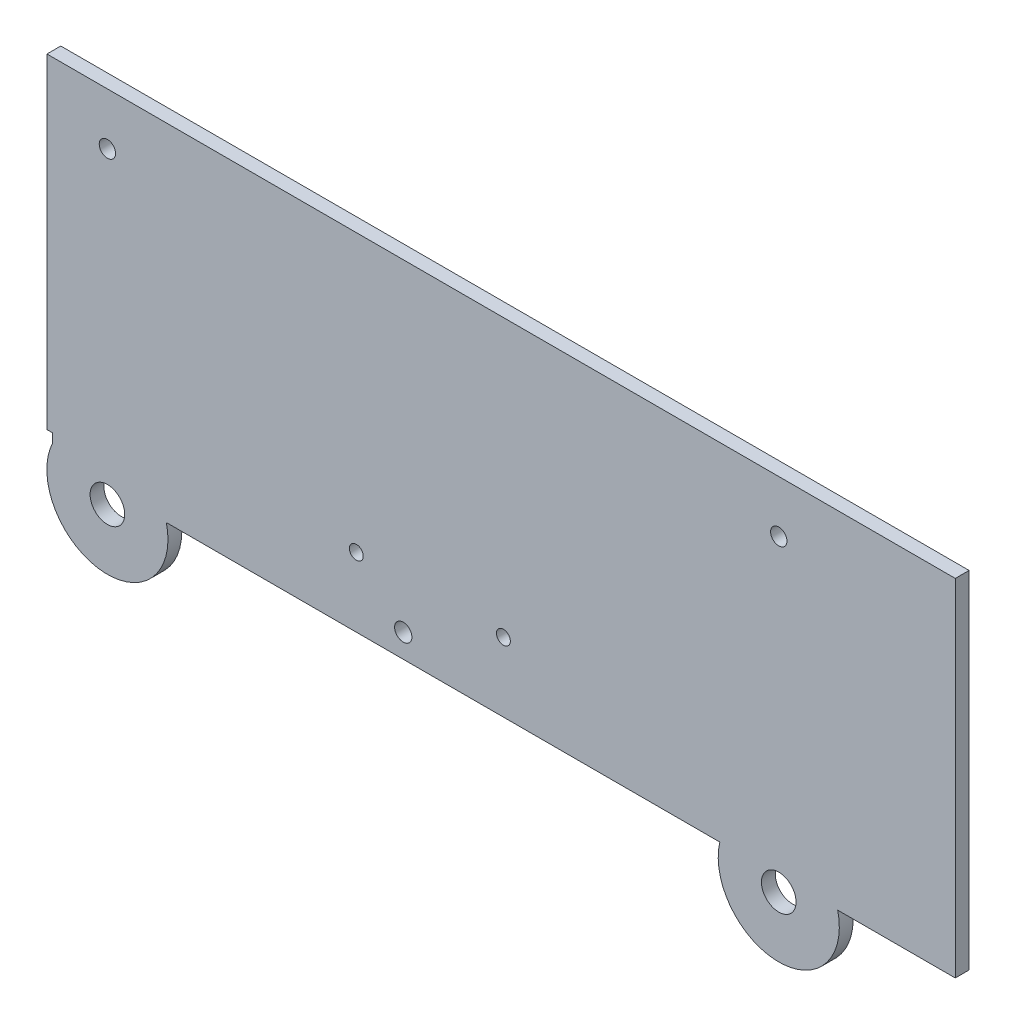
ISO-10303-21;
HEADER;
FILE_DESCRIPTION(('STEP AP214'),'2;1');
FILE_NAME('part.step','',(''),(''),'','','');
FILE_SCHEMA(('AUTOMOTIVE_DESIGN { 1 0 10303 214 1 1 1 1 }'));
ENDSEC;
DATA;
#1=APPLICATION_CONTEXT('core data for automotive mechanical design processes');
#2=APPLICATION_PROTOCOL_DEFINITION('international standard','automotive_design',2000,#1);
#3=PRODUCT_CONTEXT('',#1,'mechanical');
#4=PRODUCT('Part','Part','',(#3));
#5=PRODUCT_RELATED_PRODUCT_CATEGORY('part','',(#4));
#6=PRODUCT_DEFINITION_FORMATION('','',#4);
#7=PRODUCT_DEFINITION_CONTEXT('part definition',#1,'design');
#8=PRODUCT_DEFINITION('design','',#6,#7);
#9=PRODUCT_DEFINITION_SHAPE('','',#8);
#10=(LENGTH_UNIT() NAMED_UNIT(*) SI_UNIT(.MILLI.,.METRE.));
#11=(NAMED_UNIT(*) PLANE_ANGLE_UNIT() SI_UNIT($,.RADIAN.));
#12=(NAMED_UNIT(*) SI_UNIT($,.STERADIAN.) SOLID_ANGLE_UNIT());
#13=UNCERTAINTY_MEASURE_WITH_UNIT(LENGTH_MEASURE(1.E-05),#10,'distance_accuracy_value','');
#14=(GEOMETRIC_REPRESENTATION_CONTEXT(3) GLOBAL_UNCERTAINTY_ASSIGNED_CONTEXT((#13)) GLOBAL_UNIT_ASSIGNED_CONTEXT((#10,
#11,#12)) REPRESENTATION_CONTEXT('',''));
#15=CARTESIAN_POINT('',(0.,0.,0.));
#16=DIRECTION('',(0.,0.,1.));
#17=DIRECTION('',(1.,0.,0.));
#18=AXIS2_PLACEMENT_3D('',#15,#16,#17);
#19=CARTESIAN_POINT('',(0.,-31.75,-5.07492));
#20=DIRECTION('',(0.,-1.,0.));
#21=DIRECTION('',(0.,0.,-1.));
#22=AXIS2_PLACEMENT_3D('',#19,#20,#21);
#23=PLANE('',#22);
#24=DIRECTION('',(0.,0.,-1.));
#25=VECTOR('',#24,1.);
#26=CARTESIAN_POINT('',(101.426359202501,-31.75,0.));
#27=LINE('',#26,#25);
#28=CARTESIAN_POINT('',(101.426359202501,-31.75,0.));
#29=VERTEX_POINT('',#28);
#30=CARTESIAN_POINT('',(101.426359202501,-31.75,-5.07492));
#31=VERTEX_POINT('',#30);
#32=EDGE_CURVE('E209',#29,#31,#27,.T.);
#33=ORIENTED_EDGE('',*,*,#32,.F.);
#34=DIRECTION('',(1.,0.,0.));
#35=VECTOR('',#34,1.);
#36=CARTESIAN_POINT('',(0.,-31.75,0.));
#37=LINE('',#36,#35);
#38=CARTESIAN_POINT('',(-101.680359202501,-31.75,0.));
#39=VERTEX_POINT('',#38);
#40=EDGE_CURVE('E231',#39,#29,#37,.T.);
#41=ORIENTED_EDGE('',*,*,#40,.F.);
#42=DIRECTION('',(0.,0.,-1.));
#43=VECTOR('',#42,1.);
#44=CARTESIAN_POINT('',(-101.680359202501,-31.75,0.));
#45=LINE('',#44,#43);
#46=CARTESIAN_POINT('',(-101.680359202501,-31.75,-5.07492));
#47=VERTEX_POINT('',#46);
#48=EDGE_CURVE('E202',#47,#39,#45,.F.);
#49=ORIENTED_EDGE('',*,*,#48,.F.);
#50=DIRECTION('',(1.,0.,0.));
#51=VECTOR('',#50,1.);
#52=CARTESIAN_POINT('',(0.,-31.75,-5.07492));
#53=LINE('',#52,#51);
#54=EDGE_CURVE('E11',#47,#31,#53,.T.);
#55=ORIENTED_EDGE('',*,*,#54,.T.);
#56=EDGE_LOOP('',(#33,#41,#49,#55));
#57=FACE_BOUND('',#56,.T.);
#58=ADVANCED_FACE('F53',(#57),#23,.T.);
#59=CARTESIAN_POINT('',(-143.383,0.,-5.07492));
#60=DIRECTION('',(1.,0.,0.));
#61=DIRECTION('',(0.,0.,-1.));
#62=AXIS2_PLACEMENT_3D('',#59,#60,#61);
#63=PLANE('',#62);
#64=DIRECTION('',(0.,1.,0.));
#65=VECTOR('',#64,1.);
#66=CARTESIAN_POINT('',(-143.383,0.,0.));
#67=LINE('',#66,#65);
#68=CARTESIAN_POINT('',(-143.383,-27.2745686125639,0.));
#69=VERTEX_POINT('',#68);
#70=CARTESIAN_POINT('',(-143.383,-24.13,0.));
#71=VERTEX_POINT('',#70);
#72=EDGE_CURVE('E239',#69,#71,#67,.T.);
#73=ORIENTED_EDGE('',*,*,#72,.T.);
#74=DIRECTION('',(0.,0.,-1.));
#75=VECTOR('',#74,1.);
#76=CARTESIAN_POINT('',(-143.383,-24.13,-5.07492));
#77=LINE('',#76,#75);
#78=CARTESIAN_POINT('',(-143.383,-24.13,-5.07492));
#79=VERTEX_POINT('',#78);
#80=EDGE_CURVE('E133',#71,#79,#77,.T.);
#81=ORIENTED_EDGE('',*,*,#80,.T.);
#82=DIRECTION('',(0.,1.,0.));
#83=VECTOR('',#82,1.);
#84=CARTESIAN_POINT('',(-143.383,0.,-5.07492));
#85=LINE('',#84,#83);
#86=CARTESIAN_POINT('',(-143.383,-27.2745686125639,-5.07492));
#87=VERTEX_POINT('',#86);
#88=EDGE_CURVE('E63',#87,#79,#85,.T.);
#89=ORIENTED_EDGE('',*,*,#88,.F.);
#90=DIRECTION('',(0.,0.,-1.));
#91=VECTOR('',#90,1.);
#92=CARTESIAN_POINT('',(-143.383,-27.2745686125639,0.));
#93=LINE('',#92,#91);
#94=EDGE_CURVE('E190',#87,#69,#93,.F.);
#95=ORIENTED_EDGE('',*,*,#94,.T.);
#96=EDGE_LOOP('',(#73,#81,#89,#95));
#97=FACE_BOUND('',#96,.T.);
#98=ADVANCED_FACE('F305',(#97),#63,.F.);
#99=CARTESIAN_POINT('',(0.,95.25,-5.07492));
#100=DIRECTION('',(0.,-1.,0.));
#101=DIRECTION('',(0.,0.,-1.));
#102=AXIS2_PLACEMENT_3D('',#99,#100,#101);
#103=PLANE('',#102);
#104=DIRECTION('',(0.,0.,-1.));
#105=VECTOR('',#104,1.);
#106=CARTESIAN_POINT('',(187.833,95.25,0.));
#107=LINE('',#106,#105);
#108=CARTESIAN_POINT('',(187.833,95.25,0.));
#109=VERTEX_POINT('',#108);
#110=CARTESIAN_POINT('',(187.833,95.25,-5.07492));
#111=VERTEX_POINT('',#110);
#112=EDGE_CURVE('E217',#109,#111,#107,.T.);
#113=ORIENTED_EDGE('',*,*,#112,.T.);
#114=DIRECTION('',(1.,0.,0.));
#115=VECTOR('',#114,1.);
#116=CARTESIAN_POINT('',(0.,95.25,-5.07492));
#117=LINE('',#116,#115);
#118=CARTESIAN_POINT('',(-145.5039,95.25,-5.07492));
#119=VERTEX_POINT('',#118);
#120=EDGE_CURVE('E230',#119,#111,#117,.T.);
#121=ORIENTED_EDGE('',*,*,#120,.F.);
#122=DIRECTION('',(0.,0.,-1.));
#123=VECTOR('',#122,1.);
#124=CARTESIAN_POINT('',(-145.5039,95.25,0.));
#125=LINE('',#124,#123);
#126=CARTESIAN_POINT('',(-145.5039,95.25,0.));
#127=VERTEX_POINT('',#126);
#128=EDGE_CURVE('E148',#127,#119,#125,.T.);
#129=ORIENTED_EDGE('',*,*,#128,.F.);
#130=DIRECTION('',(1.,0.,0.));
#131=VECTOR('',#130,1.);
#132=CARTESIAN_POINT('',(0.,95.25,0.));
#133=LINE('',#132,#131);
#134=EDGE_CURVE('E153',#127,#109,#133,.T.);
#135=ORIENTED_EDGE('',*,*,#134,.T.);
#136=EDGE_LOOP('',(#113,#121,#129,#135));
#137=FACE_BOUND('',#136,.T.);
#138=ADVANCED_FACE('F55',(#137),#103,.F.);
#139=DIRECTION('',(0.,0.,-1.));
#140=VECTOR('',#139,1.);
#141=CARTESIAN_POINT('',(144.699640797499,-31.75,0.));
#142=LINE('',#141,#140);
#143=CARTESIAN_POINT('',(144.699640797499,-31.75,-5.07492));
#144=VERTEX_POINT('',#143);
#145=CARTESIAN_POINT('',(144.699640797499,-31.75,0.));
#146=VERTEX_POINT('',#145);
#147=EDGE_CURVE('E205',#144,#146,#142,.F.);
#148=ORIENTED_EDGE('',*,*,#147,.F.);
#149=CARTESIAN_POINT('',(187.833,-31.75,-5.07492));
#150=VERTEX_POINT('',#149);
#151=EDGE_CURVE('E65',#144,#150,#53,.T.);
#152=ORIENTED_EDGE('',*,*,#151,.T.);
#153=DIRECTION('',(0.,0.,-1.));
#154=VECTOR('',#153,1.);
#155=CARTESIAN_POINT('',(187.833,-31.75,0.));
#156=LINE('',#155,#154);
#157=CARTESIAN_POINT('',(187.833,-31.75,0.));
#158=VERTEX_POINT('',#157);
#159=EDGE_CURVE('E221',#158,#150,#156,.T.);
#160=ORIENTED_EDGE('',*,*,#159,.F.);
#161=EDGE_CURVE('E225',#146,#158,#37,.T.);
#162=ORIENTED_EDGE('',*,*,#161,.F.);
#163=EDGE_LOOP('',(#148,#152,#160,#162));
#164=FACE_BOUND('',#163,.T.);
#165=ADVANCED_FACE('F291',(#164),#23,.T.);
#166=CARTESIAN_POINT('',(0.,0.,-5.07492));
#167=DIRECTION('',(0.,0.,1.));
#168=DIRECTION('',(1.,0.,0.));
#169=AXIS2_PLACEMENT_3D('',#166,#167,#168);
#170=PLANE('',#169);
#171=CARTESIAN_POINT('',(22.0090999999999,-6.35,-5.07492));
#172=DIRECTION('',(0.,0.,-1.));
#173=DIRECTION('',(-1.,0.,0.));
#174=AXIS2_PLACEMENT_3D('',#171,#172,#173);
#175=CIRCLE('',#174,2.54);
#176=CARTESIAN_POINT('',(19.4690999999999,-6.35,-5.07492));
#177=VERTEX_POINT('',#176);
#178=EDGE_CURVE('E256',#177,#177,#175,.T.);
#179=ORIENTED_EDGE('',*,*,#178,.F.);
#180=EDGE_LOOP('',(#179));
#181=FACE_BOUND('',#180,.T.);
#182=CARTESIAN_POINT('',(-31.9659000000001,-6.35,-5.07492));
#183=DIRECTION('',(0.,0.,-1.));
#184=DIRECTION('',(-1.,0.,0.));
#185=AXIS2_PLACEMENT_3D('',#182,#183,#184);
#186=CIRCLE('',#185,2.54);
#187=CARTESIAN_POINT('',(-34.5059000000001,-6.35,-5.07492));
#188=VERTEX_POINT('',#187);
#189=EDGE_CURVE('E278',#188,#188,#186,.T.);
#190=ORIENTED_EDGE('',*,*,#189,.F.);
#191=EDGE_LOOP('',(#190));
#192=FACE_BOUND('',#191,.T.);
#193=CARTESIAN_POINT('',(-14.7458297790493,-23.114,-5.07492));
#194=DIRECTION('',(0.,0.,-1.));
#195=DIRECTION('',(-1.,0.,0.));
#196=AXIS2_PLACEMENT_3D('',#193,#194,#195);
#197=CIRCLE('',#196,3.175);
#198=CARTESIAN_POINT('',(-17.9208297790493,-23.114,-5.07492));
#199=VERTEX_POINT('',#198);
#200=EDGE_CURVE('E274',#199,#199,#197,.T.);
#201=ORIENTED_EDGE('',*,*,#200,.F.);
#202=EDGE_LOOP('',(#201));
#203=FACE_BOUND('',#202,.T.);
#204=CARTESIAN_POINT('',(123.063,76.2,-5.07492));
#205=DIRECTION('',(0.,0.,-1.));
#206=DIRECTION('',(-1.,0.,0.));
#207=AXIS2_PLACEMENT_3D('',#204,#205,#206);
#208=CIRCLE('',#207,3.00000000000001);
#209=CARTESIAN_POINT('',(120.063,76.2,-5.07491999999998));
#210=VERTEX_POINT('',#209);
#211=EDGE_CURVE('E248',#210,#210,#208,.T.);
#212=ORIENTED_EDGE('',*,*,#211,.F.);
#213=EDGE_LOOP('',(#212));
#214=FACE_BOUND('',#213,.T.);
#215=CARTESIAN_POINT('',(-123.317,76.2,-5.07492));
#216=DIRECTION('',(0.,0.,-1.));
#217=DIRECTION('',(-1.,0.,0.));
#218=AXIS2_PLACEMENT_3D('',#215,#216,#217);
#219=CIRCLE('',#218,2.99999999999999);
#220=CARTESIAN_POINT('',(-126.317,76.2,-5.07491999999998));
#221=VERTEX_POINT('',#220);
#222=EDGE_CURVE('E263',#221,#221,#219,.T.);
#223=ORIENTED_EDGE('',*,*,#222,.F.);
#224=EDGE_LOOP('',(#223));
#225=FACE_BOUND('',#224,.T.);
#226=CARTESIAN_POINT('',(-123.317,-36.83,-5.07492));
#227=DIRECTION('',(0.,0.,1.));
#228=DIRECTION('',(1.,0.,0.));
#229=AXIS2_PLACEMENT_3D('',#226,#227,#228);
#230=CIRCLE('',#229,6.35);
#231=CARTESIAN_POINT('',(-116.967,-36.83,-5.07492));
#232=VERTEX_POINT('',#231);
#233=EDGE_CURVE('E181',#232,#232,#230,.T.);
#234=ORIENTED_EDGE('',*,*,#233,.T.);
#235=EDGE_LOOP('',(#234));
#236=FACE_BOUND('',#235,.T.);
#237=CARTESIAN_POINT('',(123.063,-36.83,-5.07492));
#238=DIRECTION('',(0.,0.,1.));
#239=DIRECTION('',(1.,0.,0.));
#240=AXIS2_PLACEMENT_3D('',#237,#238,#239);
#241=CIRCLE('',#240,6.35);
#242=CARTESIAN_POINT('',(129.413,-36.83,-5.07492));
#243=VERTEX_POINT('',#242);
#244=EDGE_CURVE('E174',#243,#243,#241,.T.);
#245=ORIENTED_EDGE('',*,*,#244,.T.);
#246=EDGE_LOOP('',(#245));
#247=FACE_BOUND('',#246,.T.);
#248=ORIENTED_EDGE('',*,*,#88,.T.);
#249=DIRECTION('',(-1.,0.,0.));
#250=VECTOR('',#249,1.);
#251=CARTESIAN_POINT('',(-145.5039,-24.13,-5.07492));
#252=LINE('',#251,#250);
#253=CARTESIAN_POINT('',(-145.5039,-24.13,-5.07492));
#254=VERTEX_POINT('',#253);
#255=EDGE_CURVE('E159',#79,#254,#252,.T.);
#256=ORIENTED_EDGE('',*,*,#255,.T.);
#257=DIRECTION('',(0.,1.,0.));
#258=VECTOR('',#257,1.);
#259=CARTESIAN_POINT('',(-145.5039,95.25,-5.07492));
#260=LINE('',#259,#258);
#261=EDGE_CURVE('E140',#254,#119,#260,.T.);
#262=ORIENTED_EDGE('',*,*,#261,.T.);
#263=ORIENTED_EDGE('',*,*,#120,.T.);
#264=DIRECTION('',(0.,-1.,0.));
#265=VECTOR('',#264,1.);
#266=CARTESIAN_POINT('',(187.833,-31.75,-5.07492));
#267=LINE('',#266,#265);
#268=EDGE_CURVE('E212',#111,#150,#267,.T.);
#269=ORIENTED_EDGE('',*,*,#268,.T.);
#270=ORIENTED_EDGE('',*,*,#151,.F.);
#271=CARTESIAN_POINT('',(123.063,-36.83,-5.07492));
#272=DIRECTION('',(0.,0.,-1.));
#273=DIRECTION('',(-1.,0.,0.));
#274=AXIS2_PLACEMENT_3D('',#271,#272,#273);
#275=CIRCLE('',#274,22.225);
#276=EDGE_CURVE('E191',#144,#31,#275,.T.);
#277=ORIENTED_EDGE('',*,*,#276,.T.);
#278=ORIENTED_EDGE('',*,*,#54,.F.);
#279=CARTESIAN_POINT('',(-123.317,-36.83,-5.07492));
#280=DIRECTION('',(0.,0.,-1.));
#281=DIRECTION('',(-1.,0.,0.));
#282=AXIS2_PLACEMENT_3D('',#279,#280,#281);
#283=CIRCLE('',#282,22.225);
#284=EDGE_CURVE('E72',#47,#87,#283,.T.);
#285=ORIENTED_EDGE('',*,*,#284,.T.);
#286=EDGE_LOOP('',(#248,#256,#262,#263,#269,#270,#277,#278,#285));
#287=FACE_BOUND('',#286,.T.);
#288=ADVANCED_FACE('F288',(#181,#192,#203,#214,#225,#236,#247,#287),#170,.F.);
#289=CARTESIAN_POINT('',(0.,0.,0.));
#290=DIRECTION('',(0.,0.,1.));
#291=DIRECTION('',(1.,0.,0.));
#292=AXIS2_PLACEMENT_3D('',#289,#290,#291);
#293=PLANE('',#292);
#294=CARTESIAN_POINT('',(22.0090999999999,-6.35,0.));
#295=DIRECTION('',(0.,0.,1.));
#296=DIRECTION('',(1.,0.,0.));
#297=AXIS2_PLACEMENT_3D('',#294,#295,#296);
#298=CIRCLE('',#297,2.54);
#299=CARTESIAN_POINT('',(24.5490999999999,-6.35,0.));
#300=VERTEX_POINT('',#299);
#301=EDGE_CURVE('E57',#300,#300,#298,.T.);
#302=ORIENTED_EDGE('',*,*,#301,.F.);
#303=EDGE_LOOP('',(#302));
#304=FACE_BOUND('',#303,.T.);
#305=CARTESIAN_POINT('',(-31.9659000000001,-6.35,0.));
#306=DIRECTION('',(0.,0.,1.));
#307=DIRECTION('',(1.,0.,0.));
#308=AXIS2_PLACEMENT_3D('',#305,#306,#307);
#309=CIRCLE('',#308,2.54);
#310=CARTESIAN_POINT('',(-29.4259000000001,-6.35,0.));
#311=VERTEX_POINT('',#310);
#312=EDGE_CURVE('E255',#311,#311,#309,.T.);
#313=ORIENTED_EDGE('',*,*,#312,.F.);
#314=EDGE_LOOP('',(#313));
#315=FACE_BOUND('',#314,.T.);
#316=CARTESIAN_POINT('',(-14.7458297790493,-23.114,0.));
#317=DIRECTION('',(0.,0.,1.));
#318=DIRECTION('',(1.,0.,0.));
#319=AXIS2_PLACEMENT_3D('',#316,#317,#318);
#320=CIRCLE('',#319,3.175);
#321=CARTESIAN_POINT('',(-11.5708297790493,-23.114,0.));
#322=VERTEX_POINT('',#321);
#323=EDGE_CURVE('E252',#322,#322,#320,.T.);
#324=ORIENTED_EDGE('',*,*,#323,.F.);
#325=EDGE_LOOP('',(#324));
#326=FACE_BOUND('',#325,.T.);
#327=CARTESIAN_POINT('',(123.063,76.2,0.));
#328=DIRECTION('',(0.,0.,1.));
#329=DIRECTION('',(1.,0.,0.));
#330=AXIS2_PLACEMENT_3D('',#327,#328,#329);
#331=CIRCLE('',#330,3.00000000000001);
#332=CARTESIAN_POINT('',(120.063,76.2,0.));
#333=VERTEX_POINT('',#332);
#334=EDGE_CURVE('E162',#333,#333,#331,.T.);
#335=ORIENTED_EDGE('',*,*,#334,.F.);
#336=EDGE_LOOP('',(#335));
#337=FACE_BOUND('',#336,.T.);
#338=CARTESIAN_POINT('',(-123.317,76.2,0.));
#339=DIRECTION('',(0.,0.,1.));
#340=DIRECTION('',(1.,0.,0.));
#341=AXIS2_PLACEMENT_3D('',#338,#339,#340);
#342=CIRCLE('',#341,2.99999999999999);
#343=CARTESIAN_POINT('',(-126.317,76.2,0.));
#344=VERTEX_POINT('',#343);
#345=EDGE_CURVE('E244',#344,#344,#342,.T.);
#346=ORIENTED_EDGE('',*,*,#345,.F.);
#347=EDGE_LOOP('',(#346));
#348=FACE_BOUND('',#347,.T.);
#349=ORIENTED_EDGE('',*,*,#134,.F.);
#350=DIRECTION('',(0.,1.,0.));
#351=VECTOR('',#350,1.);
#352=CARTESIAN_POINT('',(-145.5039,95.25,0.));
#353=LINE('',#352,#351);
#354=CARTESIAN_POINT('',(-145.5039,-24.13,0.));
#355=VERTEX_POINT('',#354);
#356=EDGE_CURVE('E139',#355,#127,#353,.T.);
#357=ORIENTED_EDGE('',*,*,#356,.F.);
#358=DIRECTION('',(-1.,0.,0.));
#359=VECTOR('',#358,1.);
#360=CARTESIAN_POINT('',(-145.5039,-24.13,0.));
#361=LINE('',#360,#359);
#362=EDGE_CURVE('E127',#71,#355,#361,.T.);
#363=ORIENTED_EDGE('',*,*,#362,.F.);
#364=ORIENTED_EDGE('',*,*,#72,.F.);
#365=CARTESIAN_POINT('',(-123.317,-36.83,0.));
#366=DIRECTION('',(0.,0.,-1.));
#367=DIRECTION('',(-1.,0.,0.));
#368=AXIS2_PLACEMENT_3D('',#365,#366,#367);
#369=CIRCLE('',#368,22.225);
#370=EDGE_CURVE('E185',#39,#69,#369,.T.);
#371=ORIENTED_EDGE('',*,*,#370,.F.);
#372=ORIENTED_EDGE('',*,*,#40,.T.);
#373=CARTESIAN_POINT('',(123.063,-36.83,0.));
#374=DIRECTION('',(0.,0.,-1.));
#375=DIRECTION('',(-1.,0.,0.));
#376=AXIS2_PLACEMENT_3D('',#373,#374,#375);
#377=CIRCLE('',#376,22.225);
#378=EDGE_CURVE('E186',#146,#29,#377,.T.);
#379=ORIENTED_EDGE('',*,*,#378,.F.);
#380=ORIENTED_EDGE('',*,*,#161,.T.);
#381=DIRECTION('',(0.,-1.,0.));
#382=VECTOR('',#381,1.);
#383=CARTESIAN_POINT('',(187.833,-31.75,0.));
#384=LINE('',#383,#382);
#385=EDGE_CURVE('E213',#109,#158,#384,.T.);
#386=ORIENTED_EDGE('',*,*,#385,.F.);
#387=EDGE_LOOP('',(#349,#357,#363,#364,#371,#372,#379,#380,#386));
#388=FACE_BOUND('',#387,.T.);
#389=CARTESIAN_POINT('',(-123.317,-36.83,0.));
#390=DIRECTION('',(0.,0.,1.));
#391=DIRECTION('',(1.,0.,0.));
#392=AXIS2_PLACEMENT_3D('',#389,#390,#391);
#393=CIRCLE('',#392,6.35);
#394=CARTESIAN_POINT('',(-116.967,-36.83,0.));
#395=VERTEX_POINT('',#394);
#396=EDGE_CURVE('E170',#395,#395,#393,.T.);
#397=ORIENTED_EDGE('',*,*,#396,.F.);
#398=EDGE_LOOP('',(#397));
#399=FACE_BOUND('',#398,.T.);
#400=CARTESIAN_POINT('',(123.063,-36.83,0.));
#401=DIRECTION('',(0.,0.,1.));
#402=DIRECTION('',(1.,0.,0.));
#403=AXIS2_PLACEMENT_3D('',#400,#401,#402);
#404=CIRCLE('',#403,6.35);
#405=CARTESIAN_POINT('',(129.413,-36.83,0.));
#406=VERTEX_POINT('',#405);
#407=EDGE_CURVE('E169',#406,#406,#404,.T.);
#408=ORIENTED_EDGE('',*,*,#407,.F.);
#409=EDGE_LOOP('',(#408));
#410=FACE_BOUND('',#409,.T.);
#411=ADVANCED_FACE('F150',(#304,#315,#326,#337,#348,#388,#399,#410),#293,.T.);
#412=CARTESIAN_POINT('',(187.833,-31.75,0.));
#413=DIRECTION('',(1.,0.,0.));
#414=DIRECTION('',(0.,0.,-1.));
#415=AXIS2_PLACEMENT_3D('',#412,#413,#414);
#416=PLANE('',#415);
#417=ORIENTED_EDGE('',*,*,#268,.F.);
#418=ORIENTED_EDGE('',*,*,#112,.F.);
#419=ORIENTED_EDGE('',*,*,#385,.T.);
#420=ORIENTED_EDGE('',*,*,#159,.T.);
#421=EDGE_LOOP('',(#417,#418,#419,#420));
#422=FACE_BOUND('',#421,.T.);
#423=ADVANCED_FACE('F320',(#422),#416,.T.);
#424=CARTESIAN_POINT('',(123.063,-36.83,0.));
#425=DIRECTION('',(0.,0.,-1.));
#426=DIRECTION('',(-1.,0.,0.));
#427=AXIS2_PLACEMENT_3D('',#424,#425,#426);
#428=CYLINDRICAL_SURFACE('',#427,22.225);
#429=ORIENTED_EDGE('',*,*,#378,.T.);
#430=ORIENTED_EDGE('',*,*,#32,.T.);
#431=ORIENTED_EDGE('',*,*,#276,.F.);
#432=ORIENTED_EDGE('',*,*,#147,.T.);
#433=EDGE_LOOP('',(#429,#430,#431,#432));
#434=FACE_BOUND('',#433,.T.);
#435=ADVANCED_FACE('F312',(#434),#428,.T.);
#436=CARTESIAN_POINT('',(-123.317,-36.83,0.));
#437=DIRECTION('',(0.,0.,-1.));
#438=DIRECTION('',(-1.,0.,0.));
#439=AXIS2_PLACEMENT_3D('',#436,#437,#438);
#440=CYLINDRICAL_SURFACE('',#439,22.225);
#441=ORIENTED_EDGE('',*,*,#284,.F.);
#442=ORIENTED_EDGE('',*,*,#48,.T.);
#443=ORIENTED_EDGE('',*,*,#370,.T.);
#444=ORIENTED_EDGE('',*,*,#94,.F.);
#445=EDGE_LOOP('',(#441,#442,#443,#444));
#446=FACE_BOUND('',#445,.T.);
#447=ADVANCED_FACE('F337',(#446),#440,.T.);
#448=CARTESIAN_POINT('',(123.063,-36.83,-5.588));
#449=DIRECTION('',(0.,0.,1.));
#450=DIRECTION('',(1.,0.,0.));
#451=AXIS2_PLACEMENT_3D('',#448,#449,#450);
#452=CYLINDRICAL_SURFACE('',#451,6.35);
#453=ORIENTED_EDGE('',*,*,#407,.T.);
#454=EDGE_LOOP('',(#453));
#455=FACE_BOUND('',#454,.T.);
#456=ORIENTED_EDGE('',*,*,#244,.F.);
#457=EDGE_LOOP('',(#456));
#458=FACE_BOUND('',#457,.T.);
#459=ADVANCED_FACE('F340',(#455,#458),#452,.F.);
#460=CARTESIAN_POINT('',(-123.317,-36.83,-5.588));
#461=DIRECTION('',(0.,0.,1.));
#462=DIRECTION('',(1.,0.,0.));
#463=AXIS2_PLACEMENT_3D('',#460,#461,#462);
#464=CYLINDRICAL_SURFACE('',#463,6.35);
#465=ORIENTED_EDGE('',*,*,#396,.T.);
#466=EDGE_LOOP('',(#465));
#467=FACE_BOUND('',#466,.T.);
#468=ORIENTED_EDGE('',*,*,#233,.F.);
#469=EDGE_LOOP('',(#468));
#470=FACE_BOUND('',#469,.T.);
#471=ADVANCED_FACE('F345',(#467,#470),#464,.F.);
#472=CARTESIAN_POINT('',(-145.5039,-24.13,0.));
#473=DIRECTION('',(0.,-1.,0.));
#474=DIRECTION('',(0.,0.,-1.));
#475=AXIS2_PLACEMENT_3D('',#472,#473,#474);
#476=PLANE('',#475);
#477=ORIENTED_EDGE('',*,*,#80,.F.);
#478=ORIENTED_EDGE('',*,*,#362,.T.);
#479=DIRECTION('',(0.,0.,-1.));
#480=VECTOR('',#479,1.);
#481=CARTESIAN_POINT('',(-145.5039,-24.13,0.));
#482=LINE('',#481,#480);
#483=EDGE_CURVE('E130',#355,#254,#482,.T.);
#484=ORIENTED_EDGE('',*,*,#483,.T.);
#485=ORIENTED_EDGE('',*,*,#255,.F.);
#486=EDGE_LOOP('',(#477,#478,#484,#485));
#487=FACE_BOUND('',#486,.T.);
#488=ADVANCED_FACE('F129',(#487),#476,.T.);
#489=CARTESIAN_POINT('',(-145.5039,95.25,0.));
#490=DIRECTION('',(-1.,0.,0.));
#491=DIRECTION('',(0.,-1.,0.));
#492=AXIS2_PLACEMENT_3D('',#489,#490,#491);
#493=PLANE('',#492);
#494=ORIENTED_EDGE('',*,*,#261,.F.);
#495=ORIENTED_EDGE('',*,*,#483,.F.);
#496=ORIENTED_EDGE('',*,*,#356,.T.);
#497=ORIENTED_EDGE('',*,*,#128,.T.);
#498=EDGE_LOOP('',(#494,#495,#496,#497));
#499=FACE_BOUND('',#498,.T.);
#500=ADVANCED_FACE('F144',(#499),#493,.T.);
#501=CARTESIAN_POINT('',(-123.317,76.2,394.97508));
#502=DIRECTION('',(0.,0.,-1.));
#503=DIRECTION('',(-1.,0.,0.));
#504=AXIS2_PLACEMENT_3D('',#501,#502,#503);
#505=CYLINDRICAL_SURFACE('',#504,2.99999999999999);
#506=CARTESIAN_POINT('',(-126.317,76.2,0.));
#507=CARTESIAN_POINT('',(-126.317,76.2,-0.0528637500000021));
#508=CARTESIAN_POINT('',(-126.317,76.2,-0.105727500000004));
#509=CARTESIAN_POINT('',(-126.317,76.2,-0.211455000000009));
#510=CARTESIAN_POINT('',(-126.317,76.2,-0.264318750000011));
#511=CARTESIAN_POINT('',(-126.317,76.2,-0.370046250000015));
#512=CARTESIAN_POINT('',(-126.317,76.2,-0.422910000000017));
#513=CARTESIAN_POINT('',(-126.317,76.2,-0.528637500000021));
#514=CARTESIAN_POINT('',(-126.317,76.2,-0.581501250000023));
#515=CARTESIAN_POINT('',(-126.317,76.2,-0.687228750000009));
#516=CARTESIAN_POINT('',(-126.317,76.2,-0.740092499999993));
#517=CARTESIAN_POINT('',(-126.317,76.2,-0.845819999999979));
#518=CARTESIAN_POINT('',(-126.317,76.2,-0.898683749999981));
#519=CARTESIAN_POINT('',(-126.317,76.2,-1.00441124999999));
#520=CARTESIAN_POINT('',(-126.317,76.2,-1.05727499999999));
#521=CARTESIAN_POINT('',(-126.317,76.2,-1.16300249999999));
#522=CARTESIAN_POINT('',(-126.317,76.2,-1.21586624999999));
#523=CARTESIAN_POINT('',(-126.317,76.2,-1.32159375));
#524=CARTESIAN_POINT('',(-126.317,76.2,-1.3744575));
#525=CARTESIAN_POINT('',(-126.317,76.2,-1.480185));
#526=CARTESIAN_POINT('',(-126.317,76.2,-1.53304875000001));
#527=CARTESIAN_POINT('',(-126.317,76.2,-1.63877625000001));
#528=CARTESIAN_POINT('',(-126.317,76.2,-1.69164000000001));
#529=CARTESIAN_POINT('',(-126.317,76.2,-1.7973675));
#530=CARTESIAN_POINT('',(-126.317,76.2,-1.85023124999998));
#531=CARTESIAN_POINT('',(-126.317,76.2,-1.95595874999997));
#532=CARTESIAN_POINT('',(-126.317,76.2,-2.00882249999997));
#533=CARTESIAN_POINT('',(-126.317,76.2,-2.11454999999997));
#534=CARTESIAN_POINT('',(-126.317,76.2,-2.16741374999998));
#535=CARTESIAN_POINT('',(-126.317,76.2,-2.27314124999998));
#536=CARTESIAN_POINT('',(-126.317,76.2,-2.32600499999998));
#537=CARTESIAN_POINT('',(-126.317,76.2,-2.43173249999999));
#538=CARTESIAN_POINT('',(-126.317,76.2,-2.48459624999999));
#539=CARTESIAN_POINT('',(-126.317,76.2,-2.59032374999999));
#540=CARTESIAN_POINT('',(-126.317,76.2,-2.6431875));
#541=CARTESIAN_POINT('',(-126.317,76.2,-2.748915));
#542=CARTESIAN_POINT('',(-126.317,76.2,-2.80177875));
#543=CARTESIAN_POINT('',(-126.317,76.2,-2.90750625000001));
#544=CARTESIAN_POINT('',(-126.317,76.2,-2.96037000000001));
#545=CARTESIAN_POINT('',(-126.317,76.2,-3.06609750000001));
#546=CARTESIAN_POINT('',(-126.317,76.2,-3.11896125000002));
#547=CARTESIAN_POINT('',(-126.317,76.2,-3.22468875));
#548=CARTESIAN_POINT('',(-126.317,76.2,-3.27755249999998));
#549=CARTESIAN_POINT('',(-126.317,76.2,-3.38327999999997));
#550=CARTESIAN_POINT('',(-126.317,76.2,-3.43614374999997));
#551=CARTESIAN_POINT('',(-126.317,76.2,-3.54187124999998));
#552=CARTESIAN_POINT('',(-126.317,76.2,-3.59473499999998));
#553=CARTESIAN_POINT('',(-126.317,76.2,-3.70046249999998));
#554=CARTESIAN_POINT('',(-126.317,76.2,-3.75332624999999));
#555=CARTESIAN_POINT('',(-126.317,76.2,-3.85905374999999));
#556=CARTESIAN_POINT('',(-126.317,76.2,-3.91191749999999));
#557=CARTESIAN_POINT('',(-126.317,76.2,-4.017645));
#558=CARTESIAN_POINT('',(-126.317,76.2,-4.07050875));
#559=CARTESIAN_POINT('',(-126.317,76.2,-4.17623625));
#560=CARTESIAN_POINT('',(-126.317,76.2,-4.2291));
#561=CARTESIAN_POINT('',(-126.317,76.2,-4.33482749999999));
#562=CARTESIAN_POINT('',(-126.317,76.2,-4.38769124999997));
#563=CARTESIAN_POINT('',(-126.317,76.2,-4.49341874999996));
#564=CARTESIAN_POINT('',(-126.317,76.2,-4.54628249999996));
#565=CARTESIAN_POINT('',(-126.317,76.2,-4.65200999999997));
#566=CARTESIAN_POINT('',(-126.317,76.2,-4.70487374999997));
#567=CARTESIAN_POINT('',(-126.317,76.2,-4.81060124999997));
#568=CARTESIAN_POINT('',(-126.317,76.2,-4.86346499999997));
#569=CARTESIAN_POINT('',(-126.317,76.2,-4.96919249999998));
#570=CARTESIAN_POINT('',(-126.317,76.2,-5.02205624999998));
#571=CARTESIAN_POINT('',(-126.317,76.2,-5.07491999999998));
#572=B_SPLINE_CURVE_WITH_KNOTS('',3,(#506,#507,#508,#509,#510,#511,#512,#513,#514,#515,#516,
#517,#518,#519,#520,#521,#522,#523,#524,#525,#526,#527,#528,#529,#530,#531,#532,#533,#534,#535,
#536,#537,#538,#539,#540,#541,#542,#543,#544,#545,#546,#547,#548,#549,#550,#551,#552,#553,#554,
#555,#556,#557,#558,#559,#560,#561,#562,#563,#564,#565,#566,#567,#568,#569,#570,#571),
.UNSPECIFIED.,.F.,.F.,(4,2,2,2,2,2,2,2,2,2,2,2,2,2,2,2,2,2,2,2,2,2,2,2,2,2,2,2,2,2,2,2,4),(0.,
0.158591250000006,0.317182500000013,0.475773750000019,0.634365000000026,0.792956249999976,
0.951547499999983,1.11013874999999,1.26873,1.42732125,1.58591250000001,1.74450375000001,
1.90309499999997,2.06168624999997,2.22027749999998,2.37886874999998,2.53745999999999,2.69605125,
2.8546425,3.01323375000001,3.17182500000002,3.33041624999997,3.48900749999997,3.64759874999998,
3.80618999999999,3.96478124999999,4.1233725,4.28196375000001,4.44055499999996,4.59914624999996,
4.75773749999997,4.91632874999998,5.07491999999998),.UNSPECIFIED.);
#573=EDGE_CURVE('BSEAM354',#344,#221,#572,.T.);
#574=ORIENTED_EDGE('',*,*,#345,.T.);
#575=ORIENTED_EDGE('',*,*,#222,.T.);
#576=ORIENTED_EDGE('',*,*,#573,.T.);
#577=ORIENTED_EDGE('',*,*,#573,.F.);
#578=EDGE_LOOP('',(#574,#576,#575,#577));
#579=FACE_BOUND('',#578,.T.);
#580=ADVANCED_FACE('F354',(#579),#505,.F.);
#581=CARTESIAN_POINT('',(123.063,76.2,394.97508));
#582=DIRECTION('',(0.,0.,-1.));
#583=DIRECTION('',(-1.,0.,0.));
#584=AXIS2_PLACEMENT_3D('',#581,#582,#583);
#585=CYLINDRICAL_SURFACE('',#584,3.00000000000001);
#586=CARTESIAN_POINT('',(120.063,76.2,0.));
#587=CARTESIAN_POINT('',(120.063,76.2,-0.0528637500000021));
#588=CARTESIAN_POINT('',(120.063,76.2,-0.105727500000004));
#589=CARTESIAN_POINT('',(120.063,76.2,-0.211455000000009));
#590=CARTESIAN_POINT('',(120.063,76.2,-0.264318750000011));
#591=CARTESIAN_POINT('',(120.063,76.2,-0.370046250000015));
#592=CARTESIAN_POINT('',(120.063,76.2,-0.422910000000017));
#593=CARTESIAN_POINT('',(120.063,76.2,-0.528637500000021));
#594=CARTESIAN_POINT('',(120.063,76.2,-0.581501250000023));
#595=CARTESIAN_POINT('',(120.063,76.2,-0.687228750000009));
#596=CARTESIAN_POINT('',(120.063,76.2,-0.740092499999993));
#597=CARTESIAN_POINT('',(120.063,76.2,-0.845819999999979));
#598=CARTESIAN_POINT('',(120.063,76.2,-0.898683749999981));
#599=CARTESIAN_POINT('',(120.063,76.2,-1.00441124999999));
#600=CARTESIAN_POINT('',(120.063,76.2,-1.05727499999999));
#601=CARTESIAN_POINT('',(120.063,76.2,-1.16300249999999));
#602=CARTESIAN_POINT('',(120.063,76.2,-1.21586624999999));
#603=CARTESIAN_POINT('',(120.063,76.2,-1.32159375));
#604=CARTESIAN_POINT('',(120.063,76.2,-1.3744575));
#605=CARTESIAN_POINT('',(120.063,76.2,-1.480185));
#606=CARTESIAN_POINT('',(120.063,76.2,-1.53304875000001));
#607=CARTESIAN_POINT('',(120.063,76.2,-1.63877625000001));
#608=CARTESIAN_POINT('',(120.063,76.2,-1.69164000000001));
#609=CARTESIAN_POINT('',(120.063,76.2,-1.7973675));
#610=CARTESIAN_POINT('',(120.063,76.2,-1.85023124999998));
#611=CARTESIAN_POINT('',(120.063,76.2,-1.95595874999997));
#612=CARTESIAN_POINT('',(120.063,76.2,-2.00882249999997));
#613=CARTESIAN_POINT('',(120.063,76.2,-2.11454999999997));
#614=CARTESIAN_POINT('',(120.063,76.2,-2.16741374999998));
#615=CARTESIAN_POINT('',(120.063,76.2,-2.27314124999998));
#616=CARTESIAN_POINT('',(120.063,76.2,-2.32600499999998));
#617=CARTESIAN_POINT('',(120.063,76.2,-2.43173249999999));
#618=CARTESIAN_POINT('',(120.063,76.2,-2.48459624999999));
#619=CARTESIAN_POINT('',(120.063,76.2,-2.59032374999999));
#620=CARTESIAN_POINT('',(120.063,76.2,-2.6431875));
#621=CARTESIAN_POINT('',(120.063,76.2,-2.748915));
#622=CARTESIAN_POINT('',(120.063,76.2,-2.80177875));
#623=CARTESIAN_POINT('',(120.063,76.2,-2.90750625000001));
#624=CARTESIAN_POINT('',(120.063,76.2,-2.96037000000001));
#625=CARTESIAN_POINT('',(120.063,76.2,-3.06609750000001));
#626=CARTESIAN_POINT('',(120.063,76.2,-3.11896125000002));
#627=CARTESIAN_POINT('',(120.063,76.2,-3.22468875));
#628=CARTESIAN_POINT('',(120.063,76.2,-3.27755249999998));
#629=CARTESIAN_POINT('',(120.063,76.2,-3.38327999999997));
#630=CARTESIAN_POINT('',(120.063,76.2,-3.43614374999997));
#631=CARTESIAN_POINT('',(120.063,76.2,-3.54187124999998));
#632=CARTESIAN_POINT('',(120.063,76.2,-3.59473499999998));
#633=CARTESIAN_POINT('',(120.063,76.2,-3.70046249999998));
#634=CARTESIAN_POINT('',(120.063,76.2,-3.75332624999999));
#635=CARTESIAN_POINT('',(120.063,76.2,-3.85905374999999));
#636=CARTESIAN_POINT('',(120.063,76.2,-3.91191749999999));
#637=CARTESIAN_POINT('',(120.063,76.2,-4.017645));
#638=CARTESIAN_POINT('',(120.063,76.2,-4.07050875));
#639=CARTESIAN_POINT('',(120.063,76.2,-4.17623625));
#640=CARTESIAN_POINT('',(120.063,76.2,-4.2291));
#641=CARTESIAN_POINT('',(120.063,76.2,-4.33482749999999));
#642=CARTESIAN_POINT('',(120.063,76.2,-4.38769124999997));
#643=CARTESIAN_POINT('',(120.063,76.2,-4.49341874999996));
#644=CARTESIAN_POINT('',(120.063,76.2,-4.54628249999996));
#645=CARTESIAN_POINT('',(120.063,76.2,-4.65200999999997));
#646=CARTESIAN_POINT('',(120.063,76.2,-4.70487374999997));
#647=CARTESIAN_POINT('',(120.063,76.2,-4.81060124999997));
#648=CARTESIAN_POINT('',(120.063,76.2,-4.86346499999997));
#649=CARTESIAN_POINT('',(120.063,76.2,-4.96919249999998));
#650=CARTESIAN_POINT('',(120.063,76.2,-5.02205624999998));
#651=CARTESIAN_POINT('',(120.063,76.2,-5.07491999999998));
#652=B_SPLINE_CURVE_WITH_KNOTS('',3,(#586,#587,#588,#589,#590,#591,#592,#593,#594,#595,#596,
#597,#598,#599,#600,#601,#602,#603,#604,#605,#606,#607,#608,#609,#610,#611,#612,#613,#614,#615,
#616,#617,#618,#619,#620,#621,#622,#623,#624,#625,#626,#627,#628,#629,#630,#631,#632,#633,#634,
#635,#636,#637,#638,#639,#640,#641,#642,#643,#644,#645,#646,#647,#648,#649,#650,#651),
.UNSPECIFIED.,.F.,.F.,(4,2,2,2,2,2,2,2,2,2,2,2,2,2,2,2,2,2,2,2,2,2,2,2,2,2,2,2,2,2,2,2,4),(0.,
0.158591250000006,0.317182500000013,0.475773750000019,0.634365000000026,0.792956249999976,
0.951547499999983,1.11013874999999,1.26873,1.42732125,1.58591250000001,1.74450375000001,
1.90309499999997,2.06168624999997,2.22027749999998,2.37886874999998,2.53745999999999,2.69605125,
2.8546425,3.01323375000001,3.17182500000002,3.33041624999997,3.48900749999997,3.64759874999998,
3.80618999999999,3.96478124999999,4.1233725,4.28196375000001,4.44055499999996,4.59914624999996,
4.75773749999997,4.91632874999998,5.07491999999998),.UNSPECIFIED.);
#653=EDGE_CURVE('BSEAM357',#333,#210,#652,.T.);
#654=ORIENTED_EDGE('',*,*,#334,.T.);
#655=ORIENTED_EDGE('',*,*,#211,.T.);
#656=ORIENTED_EDGE('',*,*,#653,.T.);
#657=ORIENTED_EDGE('',*,*,#653,.F.);
#658=EDGE_LOOP('',(#654,#656,#655,#657));
#659=FACE_BOUND('',#658,.T.);
#660=ADVANCED_FACE('F357',(#659),#585,.F.);
#661=CARTESIAN_POINT('',(-14.7458297790493,-23.114,1.27508));
#662=DIRECTION('',(0.,0.,-1.));
#663=DIRECTION('',(-1.,0.,0.));
#664=AXIS2_PLACEMENT_3D('',#661,#662,#663);
#665=CYLINDRICAL_SURFACE('',#664,3.175);
#666=ORIENTED_EDGE('',*,*,#323,.T.);
#667=EDGE_LOOP('',(#666));
#668=FACE_BOUND('',#667,.T.);
#669=ORIENTED_EDGE('',*,*,#200,.T.);
#670=EDGE_LOOP('',(#669));
#671=FACE_BOUND('',#670,.T.);
#672=ADVANCED_FACE('F361',(#668,#671),#665,.F.);
#673=CARTESIAN_POINT('',(-31.9659000000001,-6.35,1.27508));
#674=DIRECTION('',(0.,0.,-1.));
#675=DIRECTION('',(-1.,0.,0.));
#676=AXIS2_PLACEMENT_3D('',#673,#674,#675);
#677=CYLINDRICAL_SURFACE('',#676,2.54);
#678=ORIENTED_EDGE('',*,*,#312,.T.);
#679=EDGE_LOOP('',(#678));
#680=FACE_BOUND('',#679,.T.);
#681=ORIENTED_EDGE('',*,*,#189,.T.);
#682=EDGE_LOOP('',(#681));
#683=FACE_BOUND('',#682,.T.);
#684=ADVANCED_FACE('F365',(#680,#683),#677,.F.);
#685=CARTESIAN_POINT('',(22.0090999999999,-6.35,1.27508));
#686=DIRECTION('',(0.,0.,-1.));
#687=DIRECTION('',(-1.,0.,0.));
#688=AXIS2_PLACEMENT_3D('',#685,#686,#687);
#689=CYLINDRICAL_SURFACE('',#688,2.54);
#690=ORIENTED_EDGE('',*,*,#301,.T.);
#691=EDGE_LOOP('',(#690));
#692=FACE_BOUND('',#691,.T.);
#693=ORIENTED_EDGE('',*,*,#178,.T.);
#694=EDGE_LOOP('',(#693));
#695=FACE_BOUND('',#694,.T.);
#696=ADVANCED_FACE('F286',(#692,#695),#689,.F.);
#697=CLOSED_SHELL('',(#58,#98,#138,#165,#288,#411,#423,#435,#447,#459,#471,#488,#500,#580,#660,
#672,#684,#696));
#698=MANIFOLD_SOLID_BREP('B2',#697);
#699=ADVANCED_BREP_SHAPE_REPRESENTATION('',(#18,#698),#14);
#700=SHAPE_DEFINITION_REPRESENTATION(#9,#699);
ENDSEC;
END-ISO-10303-21;
